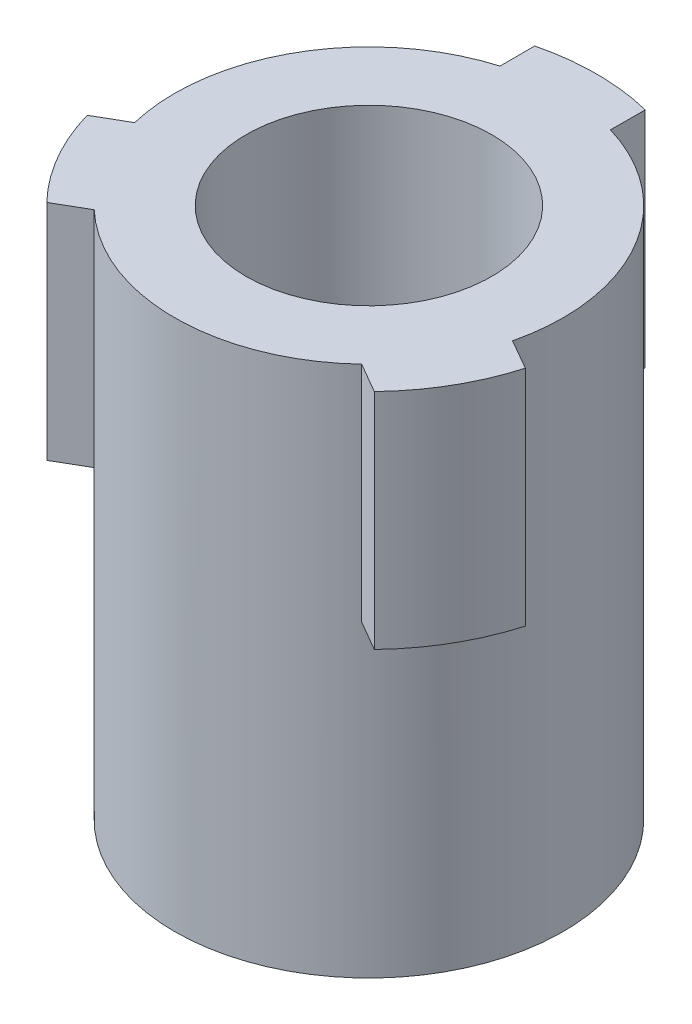
ISO-10303-21;
HEADER;
FILE_DESCRIPTION(('STEP AP214'),'2;1');
FILE_NAME('part.step','',(''),(''),'','','');
FILE_SCHEMA(('AUTOMOTIVE_DESIGN { 1 0 10303 214 1 1 1 1 }'));
ENDSEC;
DATA;
#1=APPLICATION_CONTEXT('core data for automotive mechanical design processes');
#2=APPLICATION_PROTOCOL_DEFINITION('international standard','automotive_design',2000,#1);
#3=PRODUCT_CONTEXT('',#1,'mechanical');
#4=PRODUCT('Part','Part','',(#3));
#5=PRODUCT_RELATED_PRODUCT_CATEGORY('part','',(#4));
#6=PRODUCT_DEFINITION_FORMATION('','',#4);
#7=PRODUCT_DEFINITION_CONTEXT('part definition',#1,'design');
#8=PRODUCT_DEFINITION('design','',#6,#7);
#9=PRODUCT_DEFINITION_SHAPE('','',#8);
#10=(LENGTH_UNIT() NAMED_UNIT(*) SI_UNIT(.MILLI.,.METRE.));
#11=(NAMED_UNIT(*) PLANE_ANGLE_UNIT() SI_UNIT($,.RADIAN.));
#12=(NAMED_UNIT(*) SI_UNIT($,.STERADIAN.) SOLID_ANGLE_UNIT());
#13=UNCERTAINTY_MEASURE_WITH_UNIT(LENGTH_MEASURE(1.E-05),#10,'distance_accuracy_value','');
#14=(GEOMETRIC_REPRESENTATION_CONTEXT(3) GLOBAL_UNCERTAINTY_ASSIGNED_CONTEXT((#13)) GLOBAL_UNIT_ASSIGNED_CONTEXT((#10,
#11,#12)) REPRESENTATION_CONTEXT('',''));
#15=CARTESIAN_POINT('',(0.,0.,0.));
#16=DIRECTION('',(0.,0.,1.));
#17=DIRECTION('',(1.,0.,0.));
#18=AXIS2_PLACEMENT_3D('',#15,#16,#17);
#19=CARTESIAN_POINT('',(0.,68.8,0.));
#20=DIRECTION('',(0.,-1.,0.));
#21=DIRECTION('',(0.,0.,-1.));
#22=AXIS2_PLACEMENT_3D('',#19,#20,#21);
#23=CYLINDRICAL_SURFACE('',#22,5.5);
#24=CARTESIAN_POINT('',(0.,68.8,0.));
#25=DIRECTION('',(0.,1.,0.));
#26=DIRECTION('',(0.,0.,1.));
#27=AXIS2_PLACEMENT_3D('',#24,#25,#26);
#28=CIRCLE('',#27,5.5);
#29=CARTESIAN_POINT('',(0.,68.8,-5.5));
#30=VERTEX_POINT('',#29);
#31=EDGE_CURVE('E214',#30,#30,#28,.T.);
#32=CARTESIAN_POINT('',(0.,60.,0.));
#33=DIRECTION('',(0.,-1.,0.));
#34=DIRECTION('',(0.,0.,-1.));
#35=AXIS2_PLACEMENT_3D('',#32,#33,#34);
#36=CIRCLE('',#35,5.5);
#37=CARTESIAN_POINT('',(0.,60.,-5.5));
#38=VERTEX_POINT('',#37);
#39=EDGE_CURVE('E36',#38,#38,#36,.T.);
#40=CARTESIAN_POINT('',(0.,68.8,-5.5));
#41=CARTESIAN_POINT('',(0.,68.7083333333333,-5.5));
#42=CARTESIAN_POINT('',(0.,68.6166666666667,-5.5));
#43=CARTESIAN_POINT('',(0.,68.4333333333333,-5.5));
#44=CARTESIAN_POINT('',(0.,68.3416666666667,-5.5));
#45=CARTESIAN_POINT('',(0.,68.1583333333333,-5.5));
#46=CARTESIAN_POINT('',(0.,68.0666666666667,-5.5));
#47=CARTESIAN_POINT('',(0.,67.8833333333333,-5.5));
#48=CARTESIAN_POINT('',(0.,67.7916666666667,-5.5));
#49=CARTESIAN_POINT('',(0.,67.6083333333333,-5.5));
#50=CARTESIAN_POINT('',(0.,67.5166666666667,-5.5));
#51=CARTESIAN_POINT('',(0.,67.3333333333333,-5.5));
#52=CARTESIAN_POINT('',(0.,67.2416666666667,-5.5));
#53=CARTESIAN_POINT('',(0.,67.0583333333333,-5.5));
#54=CARTESIAN_POINT('',(0.,66.9666666666667,-5.5));
#55=CARTESIAN_POINT('',(0.,66.7833333333333,-5.5));
#56=CARTESIAN_POINT('',(0.,66.6916666666667,-5.5));
#57=CARTESIAN_POINT('',(0.,66.5083333333333,-5.5));
#58=CARTESIAN_POINT('',(0.,66.4166666666667,-5.5));
#59=CARTESIAN_POINT('',(0.,66.2333333333333,-5.5));
#60=CARTESIAN_POINT('',(0.,66.1416666666667,-5.5));
#61=CARTESIAN_POINT('',(0.,65.9583333333333,-5.5));
#62=CARTESIAN_POINT('',(0.,65.8666666666667,-5.5));
#63=CARTESIAN_POINT('',(0.,65.6833333333333,-5.5));
#64=CARTESIAN_POINT('',(0.,65.5916666666667,-5.5));
#65=CARTESIAN_POINT('',(0.,65.4083333333333,-5.5));
#66=CARTESIAN_POINT('',(0.,65.3166666666667,-5.5));
#67=CARTESIAN_POINT('',(0.,65.1333333333333,-5.5));
#68=CARTESIAN_POINT('',(0.,65.0416666666667,-5.5));
#69=CARTESIAN_POINT('',(0.,64.8583333333333,-5.5));
#70=CARTESIAN_POINT('',(0.,64.7666666666667,-5.5));
#71=CARTESIAN_POINT('',(0.,64.5833333333333,-5.5));
#72=CARTESIAN_POINT('',(0.,64.4916666666667,-5.5));
#73=CARTESIAN_POINT('',(0.,64.3083333333333,-5.5));
#74=CARTESIAN_POINT('',(0.,64.2166666666667,-5.5));
#75=CARTESIAN_POINT('',(0.,64.0333333333333,-5.5));
#76=CARTESIAN_POINT('',(0.,63.9416666666667,-5.5));
#77=CARTESIAN_POINT('',(0.,63.7583333333333,-5.5));
#78=CARTESIAN_POINT('',(0.,63.6666666666667,-5.5));
#79=CARTESIAN_POINT('',(0.,63.4833333333333,-5.5));
#80=CARTESIAN_POINT('',(0.,63.3916666666667,-5.5));
#81=CARTESIAN_POINT('',(0.,63.2083333333333,-5.5));
#82=CARTESIAN_POINT('',(0.,63.1166666666667,-5.5));
#83=CARTESIAN_POINT('',(0.,62.9333333333333,-5.5));
#84=CARTESIAN_POINT('',(0.,62.8416666666667,-5.5));
#85=CARTESIAN_POINT('',(0.,62.6583333333333,-5.5));
#86=CARTESIAN_POINT('',(0.,62.5666666666667,-5.5));
#87=CARTESIAN_POINT('',(0.,62.3833333333333,-5.5));
#88=CARTESIAN_POINT('',(0.,62.2916666666667,-5.5));
#89=CARTESIAN_POINT('',(0.,62.1083333333333,-5.5));
#90=CARTESIAN_POINT('',(0.,62.0166666666667,-5.5));
#91=CARTESIAN_POINT('',(0.,61.8333333333333,-5.5));
#92=CARTESIAN_POINT('',(0.,61.7416666666667,-5.5));
#93=CARTESIAN_POINT('',(0.,61.5583333333333,-5.5));
#94=CARTESIAN_POINT('',(0.,61.4666666666667,-5.5));
#95=CARTESIAN_POINT('',(0.,61.2833333333333,-5.5));
#96=CARTESIAN_POINT('',(0.,61.1916666666667,-5.5));
#97=CARTESIAN_POINT('',(0.,61.0083333333333,-5.5));
#98=CARTESIAN_POINT('',(0.,60.9166666666667,-5.5));
#99=CARTESIAN_POINT('',(0.,60.7333333333333,-5.5));
#100=CARTESIAN_POINT('',(0.,60.6416666666667,-5.5));
#101=CARTESIAN_POINT('',(0.,60.4583333333333,-5.5));
#102=CARTESIAN_POINT('',(0.,60.3666666666667,-5.5));
#103=CARTESIAN_POINT('',(0.,60.1833333333333,-5.5));
#104=CARTESIAN_POINT('',(0.,60.0916666666667,-5.5));
#105=CARTESIAN_POINT('',(0.,60.,-5.5));
#106=B_SPLINE_CURVE_WITH_KNOTS('',3,(#40,#41,#42,#43,#44,#45,#46,#47,#48,#49,#50,#51,#52,#53,
#54,#55,#56,#57,#58,#59,#60,#61,#62,#63,#64,#65,#66,#67,#68,#69,#70,#71,#72,#73,#74,#75,#76,#77,
#78,#79,#80,#81,#82,#83,#84,#85,#86,#87,#88,#89,#90,#91,#92,#93,#94,#95,#96,#97,#98,#99,#100,
#101,#102,#103,#104,#105),.UNSPECIFIED.,.F.,.F.,(4,2,2,2,2,2,2,2,2,2,2,2,2,2,2,2,2,2,2,2,2,2,2,
2,2,2,2,2,2,2,2,2,4),(0.,0.274999999999997,0.549999999999995,0.824999999999992,1.09999999999999,
1.37499999999999,1.64999999999998,1.925,2.19999999999999,2.47499999999999,2.74999999999999,
3.02499999999999,3.29999999999998,3.57499999999999,3.84999999999999,4.12499999999999,
4.39999999999999,4.67499999999998,4.94999999999998,5.22499999999999,5.49999999999999,
5.77499999999999,6.04999999999999,6.32499999999998,6.59999999999999,6.87499999999998,
7.14999999999998,7.42499999999999,7.69999999999999,7.97499999999998,8.24999999999998,
8.52499999999998,8.79999999999998),.UNSPECIFIED.);
#107=EDGE_CURVE('BSEAM32',#30,#38,#106,.T.);
#108=ORIENTED_EDGE('',*,*,#31,.T.);
#109=ORIENTED_EDGE('',*,*,#39,.T.);
#110=ORIENTED_EDGE('',*,*,#107,.T.);
#111=ORIENTED_EDGE('',*,*,#107,.F.);
#112=EDGE_LOOP('',(#108,#110,#109,#111));
#113=FACE_BOUND('',#112,.T.);
#114=ADVANCED_FACE('F32',(#113),#23,.F.);
#115=CARTESIAN_POINT('',(0.,68.8,0.));
#116=DIRECTION('',(0.,1.,0.));
#117=DIRECTION('',(0.,0.,1.));
#118=AXIS2_PLACEMENT_3D('',#115,#116,#117);
#119=PLANE('',#118);
#120=CARTESIAN_POINT('',(0.,68.8,0.));
#121=DIRECTION('',(0.,1.,0.));
#122=DIRECTION('',(0.,0.,1.));
#123=AXIS2_PLACEMENT_3D('',#120,#121,#122);
#124=CIRCLE('',#123,8.7);
#125=CARTESIAN_POINT('',(-5.98818743466285,68.8,6.31122898074107));
#126=VERTEX_POINT('',#125);
#127=CARTESIAN_POINT('',(5.98818743466285,68.8,6.31122898074107));
#128=VERTEX_POINT('',#127);
#129=EDGE_CURVE('E11',#126,#128,#124,.T.);
#130=ORIENTED_EDGE('',*,*,#129,.T.);
#131=DIRECTION('',(0.86469070572913,0.,0.502304671913032));
#132=VECTOR('',#131,1.);
#133=CARTESIAN_POINT('',(5.98818743466285,68.8,6.31122898074107));
#134=LINE('',#133,#132);
#135=CARTESIAN_POINT('',(7.33144613819014,68.8,7.09153703528486));
#136=VERTEX_POINT('',#135);
#137=EDGE_CURVE('E169',#128,#136,#134,.T.);
#138=ORIENTED_EDGE('',*,*,#137,.T.);
#139=CARTESIAN_POINT('',(0.,68.8,0.));
#140=DIRECTION('',(0.,1.,0.));
#141=DIRECTION('',(0.,0.,1.));
#142=AXIS2_PLACEMENT_3D('',#139,#140,#141);
#143=CIRCLE('',#142,10.2);
#144=CARTESIAN_POINT('',(9.80717429352995,68.8,2.80345008450755));
#145=VERTEX_POINT('',#144);
#146=EDGE_CURVE('E160',#136,#145,#143,.T.);
#147=ORIENTED_EDGE('',*,*,#146,.T.);
#148=DIRECTION('',(-0.867353959180858,0.,-0.497691781621206));
#149=VECTOR('',#148,1.);
#150=CARTESIAN_POINT('',(8.45977834375376,68.8,2.03030795067026));
#151=LINE('',#150,#149);
#152=CARTESIAN_POINT('',(8.45977834375376,68.8,2.03030795067026));
#153=VERTEX_POINT('',#152);
#154=EDGE_CURVE('E56',#145,#153,#151,.T.);
#155=ORIENTED_EDGE('',*,*,#154,.T.);
#156=CARTESIAN_POINT('',(2.47159090909091,68.8,-8.34153693141133));
#157=VERTEX_POINT('',#156);
#158=EDGE_CURVE('E41',#153,#157,#124,.T.);
#159=ORIENTED_EDGE('',*,*,#158,.T.);
#160=DIRECTION('',(0.0026632534517287,0.,-0.999996453534237));
#161=VECTOR('',#160,1.);
#162=CARTESIAN_POINT('',(2.47159090909091,68.8,-8.34153693141133));
#163=LINE('',#162,#161);
#164=CARTESIAN_POINT('',(2.47572815533981,68.8,-9.89498711979241));
#165=VERTEX_POINT('',#164);
#166=EDGE_CURVE('E146',#157,#165,#163,.T.);
#167=ORIENTED_EDGE('',*,*,#166,.T.);
#168=CARTESIAN_POINT('',(0.,68.8,0.));
#169=DIRECTION('',(0.,1.,0.));
#170=DIRECTION('',(0.,0.,1.));
#171=AXIS2_PLACEMENT_3D('',#168,#169,#170);
#172=CIRCLE('',#171,10.2);
#173=CARTESIAN_POINT('',(-2.47572815533981,68.8,-9.89498711979241));
#174=VERTEX_POINT('',#173);
#175=EDGE_CURVE('E156',#165,#174,#172,.T.);
#176=ORIENTED_EDGE('',*,*,#175,.T.);
#177=DIRECTION('',(0.0026632534517287,0.,0.999996453534237));
#178=VECTOR('',#177,1.);
#179=CARTESIAN_POINT('',(-2.47159090909091,68.8,-8.34153693141133));
#180=LINE('',#179,#178);
#181=CARTESIAN_POINT('',(-2.47159090909091,68.8,-8.34153693141133));
#182=VERTEX_POINT('',#181);
#183=EDGE_CURVE('E49',#174,#182,#180,.T.);
#184=ORIENTED_EDGE('',*,*,#183,.T.);
#185=CARTESIAN_POINT('',(-8.45977834375376,68.8,2.03030795067026));
#186=VERTEX_POINT('',#185);
#187=EDGE_CURVE('E42',#182,#186,#124,.T.);
#188=ORIENTED_EDGE('',*,*,#187,.T.);
#189=DIRECTION('',(-0.866018165573217,0.,0.50001253674003));
#190=VECTOR('',#189,1.);
#191=CARTESIAN_POINT('',(-8.45977834375376,68.8,2.03030795067026));
#192=LINE('',#191,#190);
#193=CARTESIAN_POINT('',(-9.80599494780969,68.8,2.8075724538346));
#194=VERTEX_POINT('',#193);
#195=EDGE_CURVE('E196',#186,#194,#192,.T.);
#196=ORIENTED_EDGE('',*,*,#195,.T.);
#197=CARTESIAN_POINT('',(0.,68.8,0.));
#198=DIRECTION('',(0.,1.,0.));
#199=DIRECTION('',(0.,0.,1.));
#200=AXIS2_PLACEMENT_3D('',#197,#198,#199);
#201=CIRCLE('',#200,10.2);
#202=CARTESIAN_POINT('',(-7.33144613819014,68.8,7.09153703528486));
#203=VERTEX_POINT('',#202);
#204=EDGE_CURVE('E185',#194,#203,#201,.T.);
#205=ORIENTED_EDGE('',*,*,#204,.T.);
#206=DIRECTION('',(0.864690705729131,0.,-0.502304671913031));
#207=VECTOR('',#206,1.);
#208=CARTESIAN_POINT('',(-5.98818743466285,68.8,6.31122898074107));
#209=LINE('',#208,#207);
#210=EDGE_CURVE('E208',#203,#126,#209,.T.);
#211=ORIENTED_EDGE('',*,*,#210,.T.);
#212=EDGE_LOOP('',(#130,#138,#147,#155,#159,#167,#176,#184,#188,#196,#205,#211));
#213=FACE_BOUND('',#212,.T.);
#214=ORIENTED_EDGE('',*,*,#31,.F.);
#215=EDGE_LOOP('',(#214));
#216=FACE_BOUND('',#215,.T.);
#217=ADVANCED_FACE('F228',(#213,#216),#119,.T.);
#218=CARTESIAN_POINT('',(0.,68.8,0.));
#219=DIRECTION('',(0.,-1.,0.));
#220=DIRECTION('',(0.,0.,-1.));
#221=AXIS2_PLACEMENT_3D('',#218,#219,#220);
#222=CYLINDRICAL_SURFACE('',#221,8.7);
#223=CARTESIAN_POINT('',(0.,45.,0.));
#224=DIRECTION('',(0.,1.,0.));
#225=DIRECTION('',(0.,0.,1.));
#226=AXIS2_PLACEMENT_3D('',#223,#224,#225);
#227=CIRCLE('',#226,8.7);
#228=CARTESIAN_POINT('',(0.,45.,8.7));
#229=VERTEX_POINT('',#228);
#230=EDGE_CURVE('E151',#229,#229,#227,.T.);
#231=ORIENTED_EDGE('',*,*,#230,.T.);
#232=EDGE_LOOP('',(#231));
#233=FACE_BOUND('',#232,.T.);
#234=CARTESIAN_POINT('',(0.,58.8,0.));
#235=DIRECTION('',(0.,-1.,0.));
#236=DIRECTION('',(0.,0.,1.));
#237=AXIS2_PLACEMENT_3D('',#234,#235,#236);
#238=CIRCLE('',#237,8.7);
#239=CARTESIAN_POINT('',(-2.47159090909091,58.8,-8.34153693141133));
#240=VERTEX_POINT('',#239);
#241=CARTESIAN_POINT('',(2.47159090909091,58.8,-8.34153693141133));
#242=VERTEX_POINT('',#241);
#243=EDGE_CURVE('E142',#240,#242,#238,.T.);
#244=ORIENTED_EDGE('',*,*,#243,.T.);
#245=DIRECTION('',(0.,1.,0.));
#246=VECTOR('',#245,1.);
#247=CARTESIAN_POINT('',(2.47159090909091,58.8,-8.34153693141133));
#248=LINE('',#247,#246);
#249=EDGE_CURVE('E161',#242,#157,#248,.T.);
#250=ORIENTED_EDGE('',*,*,#249,.T.);
#251=ORIENTED_EDGE('',*,*,#158,.F.);
#252=DIRECTION('',(0.,1.,0.));
#253=VECTOR('',#252,1.);
#254=CARTESIAN_POINT('',(8.45977834375376,58.8,2.03030795067026));
#255=LINE('',#254,#253);
#256=CARTESIAN_POINT('',(8.45977834375376,58.8,2.03030795067026));
#257=VERTEX_POINT('',#256);
#258=EDGE_CURVE('E189',#257,#153,#255,.T.);
#259=ORIENTED_EDGE('',*,*,#258,.F.);
#260=CARTESIAN_POINT('',(0.,58.8,0.));
#261=DIRECTION('',(0.,-1.,0.));
#262=DIRECTION('',(0.,0.,1.));
#263=AXIS2_PLACEMENT_3D('',#260,#261,#262);
#264=CIRCLE('',#263,8.7);
#265=CARTESIAN_POINT('',(5.98818743466285,58.8,6.31122898074107));
#266=VERTEX_POINT('',#265);
#267=EDGE_CURVE('E172',#257,#266,#264,.T.);
#268=ORIENTED_EDGE('',*,*,#267,.T.);
#269=DIRECTION('',(0.,1.,0.));
#270=VECTOR('',#269,1.);
#271=CARTESIAN_POINT('',(5.98818743466285,58.8,6.31122898074107));
#272=LINE('',#271,#270);
#273=EDGE_CURVE('E186',#266,#128,#272,.T.);
#274=ORIENTED_EDGE('',*,*,#273,.T.);
#275=ORIENTED_EDGE('',*,*,#129,.F.);
#276=DIRECTION('',(0.,1.,0.));
#277=VECTOR('',#276,1.);
#278=CARTESIAN_POINT('',(-5.98818743466285,58.8,6.31122898074106));
#279=LINE('',#278,#277);
#280=CARTESIAN_POINT('',(-5.98818743466285,58.8,6.31122898074106));
#281=VERTEX_POINT('',#280);
#282=EDGE_CURVE('E218',#281,#126,#279,.T.);
#283=ORIENTED_EDGE('',*,*,#282,.F.);
#284=CARTESIAN_POINT('',(0.,58.8,0.));
#285=DIRECTION('',(0.,-1.,0.));
#286=DIRECTION('',(0.,0.,1.));
#287=AXIS2_PLACEMENT_3D('',#284,#285,#286);
#288=CIRCLE('',#287,8.7);
#289=CARTESIAN_POINT('',(-8.45977834375376,58.8,2.03030795067026));
#290=VERTEX_POINT('',#289);
#291=EDGE_CURVE('E199',#281,#290,#288,.T.);
#292=ORIENTED_EDGE('',*,*,#291,.T.);
#293=DIRECTION('',(0.,1.,0.));
#294=VECTOR('',#293,1.);
#295=CARTESIAN_POINT('',(-8.45977834375376,58.8,2.03030795067026));
#296=LINE('',#295,#294);
#297=EDGE_CURVE('E215',#290,#186,#296,.T.);
#298=ORIENTED_EDGE('',*,*,#297,.T.);
#299=ORIENTED_EDGE('',*,*,#187,.F.);
#300=DIRECTION('',(0.,1.,0.));
#301=VECTOR('',#300,1.);
#302=CARTESIAN_POINT('',(-2.47159090909091,58.8,-8.34153693141133));
#303=LINE('',#302,#301);
#304=EDGE_CURVE('E132',#240,#182,#303,.T.);
#305=ORIENTED_EDGE('',*,*,#304,.F.);
#306=EDGE_LOOP('',(#244,#250,#251,#259,#268,#274,#275,#283,#292,#298,#299,#305));
#307=FACE_BOUND('',#306,.T.);
#308=ADVANCED_FACE('F34',(#233,#307),#222,.T.);
#309=CARTESIAN_POINT('',(0.,58.8,0.));
#310=DIRECTION('',(0.,1.,0.));
#311=DIRECTION('',(0.,0.,1.));
#312=AXIS2_PLACEMENT_3D('',#309,#310,#311);
#313=CYLINDRICAL_SURFACE('',#312,10.2);
#314=ORIENTED_EDGE('',*,*,#204,.F.);
#315=DIRECTION('',(0.,1.,0.));
#316=VECTOR('',#315,1.);
#317=CARTESIAN_POINT('',(-9.80599494780969,58.8,2.8075724538346));
#318=LINE('',#317,#316);
#319=CARTESIAN_POINT('',(-9.80599494780969,58.8,2.8075724538346));
#320=VERTEX_POINT('',#319);
#321=EDGE_CURVE('E212',#320,#194,#318,.T.);
#322=ORIENTED_EDGE('',*,*,#321,.F.);
#323=CARTESIAN_POINT('',(0.,58.8,0.));
#324=DIRECTION('',(0.,1.,0.));
#325=DIRECTION('',(0.,0.,1.));
#326=AXIS2_PLACEMENT_3D('',#323,#324,#325);
#327=CIRCLE('',#326,10.2);
#328=CARTESIAN_POINT('',(-7.33144613819014,58.8,7.09153703528486));
#329=VERTEX_POINT('',#328);
#330=EDGE_CURVE('E192',#320,#329,#327,.T.);
#331=ORIENTED_EDGE('',*,*,#330,.T.);
#332=DIRECTION('',(0.,1.,0.));
#333=VECTOR('',#332,1.);
#334=CARTESIAN_POINT('',(-7.33144613819014,58.8,7.09153703528486));
#335=LINE('',#334,#333);
#336=EDGE_CURVE('E205',#329,#203,#335,.T.);
#337=ORIENTED_EDGE('',*,*,#336,.T.);
#338=EDGE_LOOP('',(#314,#322,#331,#337));
#339=FACE_BOUND('',#338,.T.);
#340=ADVANCED_FACE('F251',(#339),#313,.T.);
#341=CARTESIAN_POINT('',(-8.45977834375376,58.8,2.03030795067026));
#342=DIRECTION('',(-0.50001253674003,0.,-0.866018165573217));
#343=DIRECTION('',(-0.866018165573218,0.,0.50001253674003));
#344=AXIS2_PLACEMENT_3D('',#341,#342,#343);
#345=PLANE('',#344);
#346=ORIENTED_EDGE('',*,*,#195,.F.);
#347=ORIENTED_EDGE('',*,*,#297,.F.);
#348=DIRECTION('',(-0.866018165573217,0.,0.50001253674003));
#349=VECTOR('',#348,1.);
#350=CARTESIAN_POINT('',(-8.45977834375376,58.8,2.03030795067026));
#351=LINE('',#350,#349);
#352=EDGE_CURVE('E202',#290,#320,#351,.T.);
#353=ORIENTED_EDGE('',*,*,#352,.T.);
#354=ORIENTED_EDGE('',*,*,#321,.T.);
#355=EDGE_LOOP('',(#346,#347,#353,#354));
#356=FACE_BOUND('',#355,.T.);
#357=ADVANCED_FACE('F254',(#356),#345,.T.);
#358=CARTESIAN_POINT('',(-5.98818743466285,58.8,6.31122898074107));
#359=DIRECTION('',(0.502304671913031,0.,0.864690705729131));
#360=DIRECTION('',(0.864690705729131,0.,-0.502304671913031));
#361=AXIS2_PLACEMENT_3D('',#358,#359,#360);
#362=PLANE('',#361);
#363=ORIENTED_EDGE('',*,*,#210,.F.);
#364=ORIENTED_EDGE('',*,*,#336,.F.);
#365=DIRECTION('',(0.864690705729131,0.,-0.502304671913031));
#366=VECTOR('',#365,1.);
#367=CARTESIAN_POINT('',(-5.98818743466285,58.8,6.31122898074107));
#368=LINE('',#367,#366);
#369=EDGE_CURVE('E195',#329,#281,#368,.T.);
#370=ORIENTED_EDGE('',*,*,#369,.T.);
#371=ORIENTED_EDGE('',*,*,#282,.T.);
#372=EDGE_LOOP('',(#363,#364,#370,#371));
#373=FACE_BOUND('',#372,.T.);
#374=ADVANCED_FACE('F256',(#373),#362,.T.);
#375=CARTESIAN_POINT('',(0.,58.8,0.));
#376=DIRECTION('',(0.,1.,0.));
#377=DIRECTION('',(0.,0.,1.));
#378=AXIS2_PLACEMENT_3D('',#375,#376,#377);
#379=PLANE('',#378);
#380=ORIENTED_EDGE('',*,*,#330,.F.);
#381=ORIENTED_EDGE('',*,*,#352,.F.);
#382=ORIENTED_EDGE('',*,*,#291,.F.);
#383=ORIENTED_EDGE('',*,*,#369,.F.);
#384=EDGE_LOOP('',(#380,#381,#382,#383));
#385=FACE_BOUND('',#384,.T.);
#386=ADVANCED_FACE('F259',(#385),#379,.F.);
#387=CARTESIAN_POINT('',(0.,58.8,0.));
#388=DIRECTION('',(0.,1.,0.));
#389=DIRECTION('',(0.,0.,1.));
#390=AXIS2_PLACEMENT_3D('',#387,#388,#389);
#391=CYLINDRICAL_SURFACE('',#390,10.2);
#392=ORIENTED_EDGE('',*,*,#146,.F.);
#393=DIRECTION('',(0.,1.,0.));
#394=VECTOR('',#393,1.);
#395=CARTESIAN_POINT('',(7.33144613819014,58.8,7.09153703528486));
#396=LINE('',#395,#394);
#397=CARTESIAN_POINT('',(7.33144613819014,58.8,7.09153703528486));
#398=VERTEX_POINT('',#397);
#399=EDGE_CURVE('E183',#398,#136,#396,.T.);
#400=ORIENTED_EDGE('',*,*,#399,.F.);
#401=CARTESIAN_POINT('',(0.,58.8,0.));
#402=DIRECTION('',(0.,1.,0.));
#403=DIRECTION('',(0.,0.,1.));
#404=AXIS2_PLACEMENT_3D('',#401,#402,#403);
#405=CIRCLE('',#404,10.2);
#406=CARTESIAN_POINT('',(9.80717429352995,58.8,2.80345008450755));
#407=VERTEX_POINT('',#406);
#408=EDGE_CURVE('E165',#398,#407,#405,.T.);
#409=ORIENTED_EDGE('',*,*,#408,.T.);
#410=DIRECTION('',(0.,1.,0.));
#411=VECTOR('',#410,1.);
#412=CARTESIAN_POINT('',(9.80717429352995,58.8,2.80345008450755));
#413=LINE('',#412,#411);
#414=EDGE_CURVE('E178',#407,#145,#413,.T.);
#415=ORIENTED_EDGE('',*,*,#414,.T.);
#416=EDGE_LOOP('',(#392,#400,#409,#415));
#417=FACE_BOUND('',#416,.T.);
#418=ADVANCED_FACE('F266',(#417),#391,.T.);
#419=CARTESIAN_POINT('',(5.98818743466285,58.8,6.31122898074107));
#420=DIRECTION('',(-0.502304671913032,0.,0.86469070572913));
#421=DIRECTION('',(0.86469070572913,0.,0.502304671913032));
#422=AXIS2_PLACEMENT_3D('',#419,#420,#421);
#423=PLANE('',#422);
#424=ORIENTED_EDGE('',*,*,#137,.F.);
#425=ORIENTED_EDGE('',*,*,#273,.F.);
#426=DIRECTION('',(0.86469070572913,0.,0.502304671913032));
#427=VECTOR('',#426,1.);
#428=CARTESIAN_POINT('',(5.98818743466285,58.8,6.31122898074107));
#429=LINE('',#428,#427);
#430=EDGE_CURVE('E175',#266,#398,#429,.T.);
#431=ORIENTED_EDGE('',*,*,#430,.T.);
#432=ORIENTED_EDGE('',*,*,#399,.T.);
#433=EDGE_LOOP('',(#424,#425,#431,#432));
#434=FACE_BOUND('',#433,.T.);
#435=ADVANCED_FACE('F270',(#434),#423,.T.);
#436=CARTESIAN_POINT('',(8.45977834375376,58.8,2.03030795067026));
#437=DIRECTION('',(0.497691781621206,0.,-0.867353959180858));
#438=DIRECTION('',(-0.867353959180858,0.,-0.497691781621206));
#439=AXIS2_PLACEMENT_3D('',#436,#437,#438);
#440=PLANE('',#439);
#441=ORIENTED_EDGE('',*,*,#154,.F.);
#442=ORIENTED_EDGE('',*,*,#414,.F.);
#443=DIRECTION('',(-0.867353959180858,0.,-0.497691781621206));
#444=VECTOR('',#443,1.);
#445=CARTESIAN_POINT('',(8.45977834375376,58.8,2.03030795067026));
#446=LINE('',#445,#444);
#447=EDGE_CURVE('E168',#407,#257,#446,.T.);
#448=ORIENTED_EDGE('',*,*,#447,.T.);
#449=ORIENTED_EDGE('',*,*,#258,.T.);
#450=EDGE_LOOP('',(#441,#442,#448,#449));
#451=FACE_BOUND('',#450,.T.);
#452=ADVANCED_FACE('F272',(#451),#440,.T.);
#453=CARTESIAN_POINT('',(0.,58.8,0.));
#454=DIRECTION('',(0.,1.,0.));
#455=DIRECTION('',(0.,0.,1.));
#456=AXIS2_PLACEMENT_3D('',#453,#454,#455);
#457=PLANE('',#456);
#458=ORIENTED_EDGE('',*,*,#408,.F.);
#459=ORIENTED_EDGE('',*,*,#430,.F.);
#460=ORIENTED_EDGE('',*,*,#267,.F.);
#461=ORIENTED_EDGE('',*,*,#447,.F.);
#462=EDGE_LOOP('',(#458,#459,#460,#461));
#463=FACE_BOUND('',#462,.T.);
#464=ADVANCED_FACE('F241',(#463),#457,.F.);
#465=CARTESIAN_POINT('',(0.,58.8,0.));
#466=DIRECTION('',(0.,1.,0.));
#467=DIRECTION('',(0.,0.,1.));
#468=AXIS2_PLACEMENT_3D('',#465,#466,#467);
#469=CYLINDRICAL_SURFACE('',#468,10.2);
#470=ORIENTED_EDGE('',*,*,#175,.F.);
#471=DIRECTION('',(0.,1.,0.));
#472=VECTOR('',#471,1.);
#473=CARTESIAN_POINT('',(2.47572815533981,58.8,-9.89498711979241));
#474=LINE('',#473,#472);
#475=CARTESIAN_POINT('',(2.47572815533981,58.8,-9.89498711979241));
#476=VERTEX_POINT('',#475);
#477=EDGE_CURVE('E145',#476,#165,#474,.T.);
#478=ORIENTED_EDGE('',*,*,#477,.F.);
#479=CARTESIAN_POINT('',(0.,58.8,0.));
#480=DIRECTION('',(0.,1.,0.));
#481=DIRECTION('',(0.,0.,1.));
#482=AXIS2_PLACEMENT_3D('',#479,#480,#481);
#483=CIRCLE('',#482,10.2);
#484=CARTESIAN_POINT('',(-2.47572815533981,58.8,-9.89498711979241));
#485=VERTEX_POINT('',#484);
#486=EDGE_CURVE('E139',#476,#485,#483,.T.);
#487=ORIENTED_EDGE('',*,*,#486,.T.);
#488=DIRECTION('',(0.,1.,0.));
#489=VECTOR('',#488,1.);
#490=CARTESIAN_POINT('',(-2.47572815533981,58.8,-9.89498711979241));
#491=LINE('',#490,#489);
#492=EDGE_CURVE('E124',#485,#174,#491,.T.);
#493=ORIENTED_EDGE('',*,*,#492,.T.);
#494=EDGE_LOOP('',(#470,#478,#487,#493));
#495=FACE_BOUND('',#494,.T.);
#496=ADVANCED_FACE('F144',(#495),#469,.T.);
#497=CARTESIAN_POINT('',(2.47159090909091,58.8,-8.34153693141133));
#498=DIRECTION('',(0.999996453534237,0.,0.0026632534517287));
#499=DIRECTION('',(0.0026632534517287,0.,-0.999996453534237));
#500=AXIS2_PLACEMENT_3D('',#497,#498,#499);
#501=PLANE('',#500);
#502=ORIENTED_EDGE('',*,*,#166,.F.);
#503=ORIENTED_EDGE('',*,*,#249,.F.);
#504=DIRECTION('',(0.0026632534517287,0.,-0.999996453534237));
#505=VECTOR('',#504,1.);
#506=CARTESIAN_POINT('',(2.47159090909091,58.8,-8.34153693141133));
#507=LINE('',#506,#505);
#508=EDGE_CURVE('E133',#242,#476,#507,.T.);
#509=ORIENTED_EDGE('',*,*,#508,.T.);
#510=ORIENTED_EDGE('',*,*,#477,.T.);
#511=EDGE_LOOP('',(#502,#503,#509,#510));
#512=FACE_BOUND('',#511,.T.);
#513=ADVANCED_FACE('F233',(#512),#501,.T.);
#514=CARTESIAN_POINT('',(-2.47159090909091,58.8,-8.34153693141133));
#515=DIRECTION('',(-0.999996453534237,0.,0.0026632534517287));
#516=DIRECTION('',(0.0026632534517287,0.,0.999996453534237));
#517=AXIS2_PLACEMENT_3D('',#514,#515,#516);
#518=PLANE('',#517);
#519=ORIENTED_EDGE('',*,*,#183,.F.);
#520=ORIENTED_EDGE('',*,*,#492,.F.);
#521=DIRECTION('',(0.0026632534517287,0.,0.999996453534237));
#522=VECTOR('',#521,1.);
#523=CARTESIAN_POINT('',(-2.47159090909091,58.8,-8.34153693141133));
#524=LINE('',#523,#522);
#525=EDGE_CURVE('E127',#485,#240,#524,.T.);
#526=ORIENTED_EDGE('',*,*,#525,.T.);
#527=ORIENTED_EDGE('',*,*,#304,.T.);
#528=EDGE_LOOP('',(#519,#520,#526,#527));
#529=FACE_BOUND('',#528,.T.);
#530=ADVANCED_FACE('F126',(#529),#518,.T.);
#531=CARTESIAN_POINT('',(0.,58.8,0.));
#532=DIRECTION('',(0.,1.,0.));
#533=DIRECTION('',(0.,0.,1.));
#534=AXIS2_PLACEMENT_3D('',#531,#532,#533);
#535=PLANE('',#534);
#536=ORIENTED_EDGE('',*,*,#486,.F.);
#537=ORIENTED_EDGE('',*,*,#508,.F.);
#538=ORIENTED_EDGE('',*,*,#243,.F.);
#539=ORIENTED_EDGE('',*,*,#525,.F.);
#540=EDGE_LOOP('',(#536,#537,#538,#539));
#541=FACE_BOUND('',#540,.T.);
#542=ADVANCED_FACE('F137',(#541),#535,.F.);
#543=CARTESIAN_POINT('',(0.,45.,0.));
#544=DIRECTION('',(0.,1.,0.));
#545=DIRECTION('',(0.,0.,1.));
#546=AXIS2_PLACEMENT_3D('',#543,#544,#545);
#547=PLANE('',#546);
#548=CARTESIAN_POINT('',(0.,45.,0.));
#549=DIRECTION('',(0.,-1.,0.));
#550=DIRECTION('',(0.,0.,-1.));
#551=AXIS2_PLACEMENT_3D('',#548,#549,#550);
#552=CIRCLE('',#551,7.3);
#553=CARTESIAN_POINT('',(0.,45.,-7.3));
#554=VERTEX_POINT('',#553);
#555=EDGE_CURVE('E373',#554,#554,#552,.T.);
#556=ORIENTED_EDGE('',*,*,#555,.F.);
#557=EDGE_LOOP('',(#556));
#558=FACE_BOUND('',#557,.T.);
#559=ORIENTED_EDGE('',*,*,#230,.F.);
#560=EDGE_LOOP('',(#559));
#561=FACE_BOUND('',#560,.T.);
#562=ADVANCED_FACE('F319',(#558,#561),#547,.F.);
#563=CARTESIAN_POINT('',(0.,60.,0.));
#564=DIRECTION('',(0.,-1.,0.));
#565=DIRECTION('',(0.,0.,-1.));
#566=AXIS2_PLACEMENT_3D('',#563,#564,#565);
#567=CYLINDRICAL_SURFACE('',#566,7.3);
#568=CARTESIAN_POINT('',(0.,60.,0.));
#569=DIRECTION('',(0.,-1.,0.));
#570=DIRECTION('',(0.,0.,-1.));
#571=AXIS2_PLACEMENT_3D('',#568,#569,#570);
#572=CIRCLE('',#571,7.3);
#573=CARTESIAN_POINT('',(0.,60.,-7.3));
#574=VERTEX_POINT('',#573);
#575=EDGE_CURVE('E372',#574,#574,#572,.T.);
#576=ORIENTED_EDGE('',*,*,#575,.F.);
#577=EDGE_LOOP('',(#576));
#578=FACE_BOUND('',#577,.T.);
#579=ORIENTED_EDGE('',*,*,#555,.T.);
#580=EDGE_LOOP('',(#579));
#581=FACE_BOUND('',#580,.T.);
#582=ADVANCED_FACE('F344',(#578,#581),#567,.F.);
#583=CARTESIAN_POINT('',(0.,60.,0.));
#584=DIRECTION('',(0.,-1.,0.));
#585=DIRECTION('',(0.,0.,-1.));
#586=AXIS2_PLACEMENT_3D('',#583,#584,#585);
#587=PLANE('',#586);
#588=ORIENTED_EDGE('',*,*,#39,.F.);
#589=EDGE_LOOP('',(#588));
#590=FACE_BOUND('',#589,.T.);
#591=ORIENTED_EDGE('',*,*,#575,.T.);
#592=EDGE_LOOP('',(#591));
#593=FACE_BOUND('',#592,.T.);
#594=ADVANCED_FACE('F353',(#590,#593),#587,.T.);
#595=CLOSED_SHELL('',(#114,#217,#308,#340,#357,#374,#386,#418,#435,#452,#464,#496,#513,#530,
#542,#562,#582,#594));
#596=MANIFOLD_SOLID_BREP('B2',#595);
#597=ADVANCED_BREP_SHAPE_REPRESENTATION('',(#18,#596),#14);
#598=SHAPE_DEFINITION_REPRESENTATION(#9,#597);
ENDSEC;
END-ISO-10303-21;
